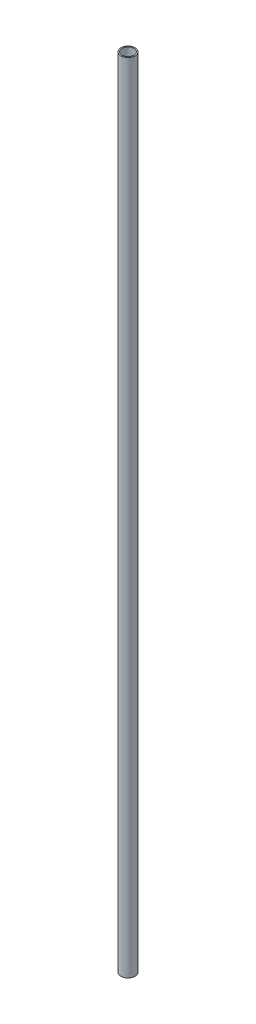
ISO-10303-21;
HEADER;
FILE_DESCRIPTION(('STEP AP214'),'2;1');
FILE_NAME('part.step','',(''),(''),'','','');
FILE_SCHEMA(('AUTOMOTIVE_DESIGN { 1 0 10303 214 1 1 1 1 }'));
ENDSEC;
DATA;
#1=APPLICATION_CONTEXT('core data for automotive mechanical design processes');
#2=APPLICATION_PROTOCOL_DEFINITION('international standard','automotive_design',2000,#1);
#3=PRODUCT_CONTEXT('',#1,'mechanical');
#4=PRODUCT('Part','Part','',(#3));
#5=PRODUCT_RELATED_PRODUCT_CATEGORY('part','',(#4));
#6=PRODUCT_DEFINITION_FORMATION('','',#4);
#7=PRODUCT_DEFINITION_CONTEXT('part definition',#1,'design');
#8=PRODUCT_DEFINITION('design','',#6,#7);
#9=PRODUCT_DEFINITION_SHAPE('','',#8);
#10=(LENGTH_UNIT() NAMED_UNIT(*) SI_UNIT(.MILLI.,.METRE.));
#11=(NAMED_UNIT(*) PLANE_ANGLE_UNIT() SI_UNIT($,.RADIAN.));
#12=(NAMED_UNIT(*) SI_UNIT($,.STERADIAN.) SOLID_ANGLE_UNIT());
#13=UNCERTAINTY_MEASURE_WITH_UNIT(LENGTH_MEASURE(1.E-05),#10,'distance_accuracy_value','');
#14=(GEOMETRIC_REPRESENTATION_CONTEXT(3) GLOBAL_UNCERTAINTY_ASSIGNED_CONTEXT((#13)) GLOBAL_UNIT_ASSIGNED_CONTEXT((#10,
#11,#12)) REPRESENTATION_CONTEXT('',''));
#15=CARTESIAN_POINT('',(0.,0.,0.));
#16=DIRECTION('',(0.,0.,1.));
#17=DIRECTION('',(1.,0.,0.));
#18=AXIS2_PLACEMENT_3D('',#15,#16,#17);
#19=CARTESIAN_POINT('',(0.,675.,0.));
#20=DIRECTION('',(0.,1.,0.));
#21=DIRECTION('',(0.,0.,1.));
#22=AXIS2_PLACEMENT_3D('',#19,#20,#21);
#23=PLANE('',#22);
#24=CARTESIAN_POINT('',(0.,675.,0.));
#25=DIRECTION('',(0.,1.,0.));
#26=DIRECTION('',(0.,0.,1.));
#27=AXIS2_PLACEMENT_3D('',#24,#25,#26);
#28=CIRCLE('',#27,6.);
#29=CARTESIAN_POINT('',(0.,675.,6.));
#30=VERTEX_POINT('',#29);
#31=EDGE_CURVE('E10',#30,#30,#28,.T.);
#32=ORIENTED_EDGE('',*,*,#31,.T.);
#33=EDGE_LOOP('',(#32));
#34=FACE_BOUND('',#33,.T.);
#35=CARTESIAN_POINT('',(0.,675.,0.));
#36=DIRECTION('',(0.,1.,0.));
#37=DIRECTION('',(0.,0.,1.));
#38=AXIS2_PLACEMENT_3D('',#35,#36,#37);
#39=CIRCLE('',#38,5.);
#40=CARTESIAN_POINT('',(0.,675.,5.));
#41=VERTEX_POINT('',#40);
#42=EDGE_CURVE('E44',#41,#41,#39,.T.);
#43=ORIENTED_EDGE('',*,*,#42,.F.);
#44=EDGE_LOOP('',(#43));
#45=FACE_BOUND('',#44,.T.);
#46=ADVANCED_FACE('F33',(#34,#45),#23,.T.);
#47=CARTESIAN_POINT('',(0.,0.,0.));
#48=DIRECTION('',(0.,1.,0.));
#49=DIRECTION('',(0.,0.,1.));
#50=AXIS2_PLACEMENT_3D('',#47,#48,#49);
#51=PLANE('',#50);
#52=CARTESIAN_POINT('',(0.,0.,0.));
#53=DIRECTION('',(0.,1.,0.));
#54=DIRECTION('',(0.,0.,1.));
#55=AXIS2_PLACEMENT_3D('',#52,#53,#54);
#56=CIRCLE('',#55,6.);
#57=CARTESIAN_POINT('',(0.,0.,6.));
#58=VERTEX_POINT('',#57);
#59=EDGE_CURVE('E37',#58,#58,#56,.T.);
#60=ORIENTED_EDGE('',*,*,#59,.F.);
#61=EDGE_LOOP('',(#60));
#62=FACE_BOUND('',#61,.T.);
#63=CARTESIAN_POINT('',(0.,0.,0.));
#64=DIRECTION('',(0.,1.,0.));
#65=DIRECTION('',(0.,0.,1.));
#66=AXIS2_PLACEMENT_3D('',#63,#64,#65);
#67=CIRCLE('',#66,5.);
#68=CARTESIAN_POINT('',(0.,0.,5.));
#69=VERTEX_POINT('',#68);
#70=EDGE_CURVE('E46',#69,#69,#67,.T.);
#71=ORIENTED_EDGE('',*,*,#70,.T.);
#72=EDGE_LOOP('',(#71));
#73=FACE_BOUND('',#72,.T.);
#74=ADVANCED_FACE('F56',(#62,#73),#51,.F.);
#75=CARTESIAN_POINT('',(0.,675.,0.));
#76=DIRECTION('',(0.,-1.,0.));
#77=DIRECTION('',(0.,0.,-1.));
#78=AXIS2_PLACEMENT_3D('',#75,#76,#77);
#79=CYLINDRICAL_SURFACE('',#78,6.);
#80=ORIENTED_EDGE('',*,*,#31,.F.);
#81=EDGE_LOOP('',(#80));
#82=FACE_BOUND('',#81,.T.);
#83=ORIENTED_EDGE('',*,*,#59,.T.);
#84=EDGE_LOOP('',(#83));
#85=FACE_BOUND('',#84,.T.);
#86=ADVANCED_FACE('F35',(#82,#85),#79,.T.);
#87=CARTESIAN_POINT('',(0.,675.,0.));
#88=DIRECTION('',(0.,-1.,0.));
#89=DIRECTION('',(0.,0.,-1.));
#90=AXIS2_PLACEMENT_3D('',#87,#88,#89);
#91=CYLINDRICAL_SURFACE('',#90,5.);
#92=ORIENTED_EDGE('',*,*,#42,.T.);
#93=EDGE_LOOP('',(#92));
#94=FACE_BOUND('',#93,.T.);
#95=ORIENTED_EDGE('',*,*,#70,.F.);
#96=EDGE_LOOP('',(#95));
#97=FACE_BOUND('',#96,.T.);
#98=ADVANCED_FACE('F52',(#94,#97),#91,.F.);
#99=CLOSED_SHELL('',(#46,#74,#86,#98));
#100=MANIFOLD_SOLID_BREP('B2',#99);
#101=ADVANCED_BREP_SHAPE_REPRESENTATION('',(#18,#100),#14);
#102=SHAPE_DEFINITION_REPRESENTATION(#9,#101);
ENDSEC;
END-ISO-10303-21;
